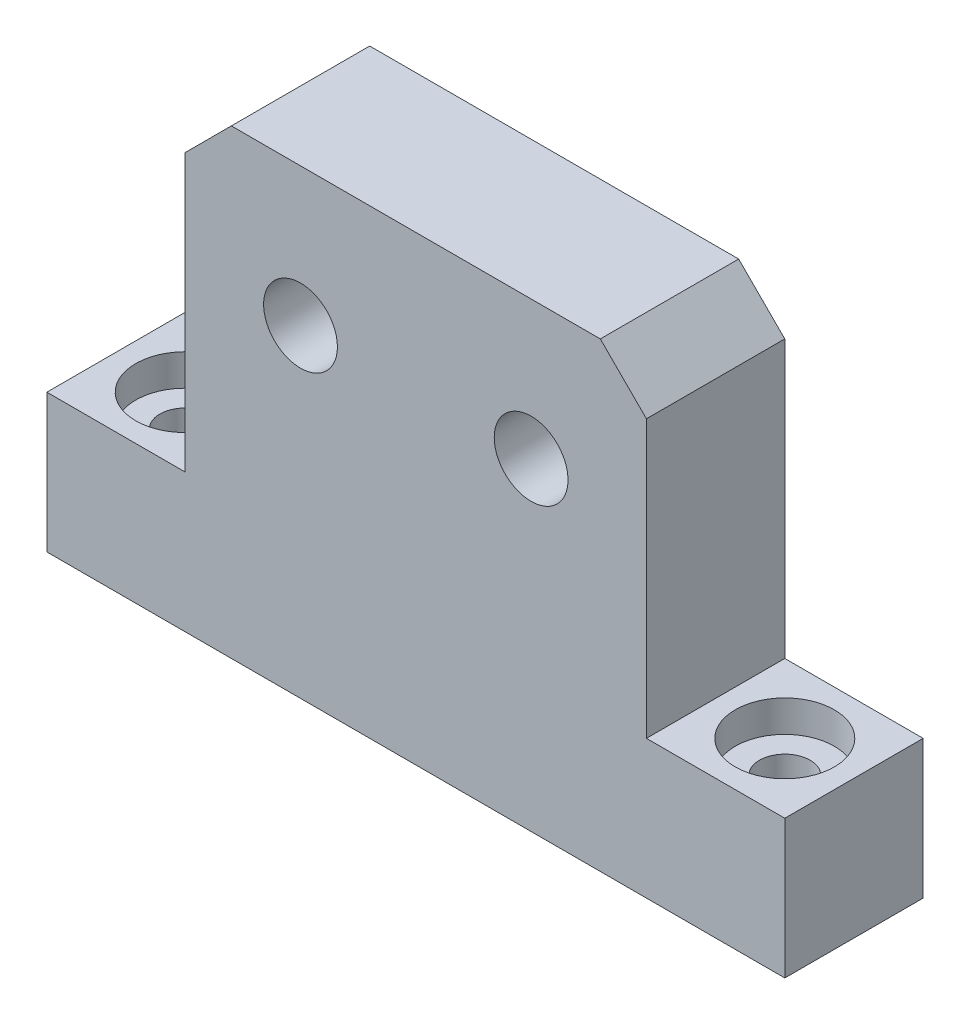
ISO-10303-21;
HEADER;
FILE_DESCRIPTION(('STEP AP214'),'2;1');
FILE_NAME('part.step','',(''),(''),'','','');
FILE_SCHEMA(('AUTOMOTIVE_DESIGN { 1 0 10303 214 1 1 1 1 }'));
ENDSEC;
DATA;
#1=APPLICATION_CONTEXT('core data for automotive mechanical design processes');
#2=APPLICATION_PROTOCOL_DEFINITION('international standard','automotive_design',2000,#1);
#3=PRODUCT_CONTEXT('',#1,'mechanical');
#4=PRODUCT('Part','Part','',(#3));
#5=PRODUCT_RELATED_PRODUCT_CATEGORY('part','',(#4));
#6=PRODUCT_DEFINITION_FORMATION('','',#4);
#7=PRODUCT_DEFINITION_CONTEXT('part definition',#1,'design');
#8=PRODUCT_DEFINITION('design','',#6,#7);
#9=PRODUCT_DEFINITION_SHAPE('','',#8);
#10=(LENGTH_UNIT() NAMED_UNIT(*) SI_UNIT(.MILLI.,.METRE.));
#11=(NAMED_UNIT(*) PLANE_ANGLE_UNIT() SI_UNIT($,.RADIAN.));
#12=(NAMED_UNIT(*) SI_UNIT($,.STERADIAN.) SOLID_ANGLE_UNIT());
#13=UNCERTAINTY_MEASURE_WITH_UNIT(LENGTH_MEASURE(1.E-05),#10,'distance_accuracy_value','');
#14=(GEOMETRIC_REPRESENTATION_CONTEXT(3) GLOBAL_UNCERTAINTY_ASSIGNED_CONTEXT((#13)) GLOBAL_UNIT_ASSIGNED_CONTEXT((#10,
#11,#12)) REPRESENTATION_CONTEXT('',''));
#15=CARTESIAN_POINT('',(0.,0.,0.));
#16=DIRECTION('',(0.,0.,1.));
#17=DIRECTION('',(1.,0.,0.));
#18=AXIS2_PLACEMENT_3D('',#15,#16,#17);
#19=CARTESIAN_POINT('',(0.,0.,30.));
#20=DIRECTION('',(0.,0.,-1.));
#21=DIRECTION('',(-1.,0.,0.));
#22=AXIS2_PLACEMENT_3D('',#19,#20,#21);
#23=PLANE('',#22);
#24=DIRECTION('',(-1.,0.,0.));
#25=VECTOR('',#24,1.);
#26=CARTESIAN_POINT('',(50.,100.,30.));
#27=LINE('',#26,#25);
#28=CARTESIAN_POINT('',(40.,100.,30.));
#29=VERTEX_POINT('',#28);
#30=CARTESIAN_POINT('',(-40.,100.,30.));
#31=VERTEX_POINT('',#30);
#32=EDGE_CURVE('E132',#29,#31,#27,.T.);
#33=ORIENTED_EDGE('',*,*,#32,.T.);
#34=DIRECTION('',(0.707106781186548,0.707106781186548,0.));
#35=VECTOR('',#34,1.);
#36=CARTESIAN_POINT('',(-50.,90.,30.));
#37=LINE('',#36,#35);
#38=CARTESIAN_POINT('',(-50.,90.,30.));
#39=VERTEX_POINT('',#38);
#40=EDGE_CURVE('E51',#31,#39,#37,.F.);
#41=ORIENTED_EDGE('',*,*,#40,.T.);
#42=DIRECTION('',(0.,-1.,0.));
#43=VECTOR('',#42,1.);
#44=CARTESIAN_POINT('',(-50.,30.,30.));
#45=LINE('',#44,#43);
#46=CARTESIAN_POINT('',(-50.,30.,30.));
#47=VERTEX_POINT('',#46);
#48=EDGE_CURVE('E121',#39,#47,#45,.T.);
#49=ORIENTED_EDGE('',*,*,#48,.T.);
#50=DIRECTION('',(-1.,0.,0.));
#51=VECTOR('',#50,1.);
#52=CARTESIAN_POINT('',(-80.,30.,30.));
#53=LINE('',#52,#51);
#54=CARTESIAN_POINT('',(-80.,30.,30.));
#55=VERTEX_POINT('',#54);
#56=EDGE_CURVE('E125',#47,#55,#53,.T.);
#57=ORIENTED_EDGE('',*,*,#56,.T.);
#58=DIRECTION('',(0.,-1.,0.));
#59=VECTOR('',#58,1.);
#60=CARTESIAN_POINT('',(-80.,0.,30.));
#61=LINE('',#60,#59);
#62=CARTESIAN_POINT('',(-80.,0.,30.));
#63=VERTEX_POINT('',#62);
#64=EDGE_CURVE('E149',#55,#63,#61,.T.);
#65=ORIENTED_EDGE('',*,*,#64,.T.);
#66=DIRECTION('',(1.,0.,0.));
#67=VECTOR('',#66,1.);
#68=CARTESIAN_POINT('',(80.,0.,30.));
#69=LINE('',#68,#67);
#70=CARTESIAN_POINT('',(80.,0.,30.));
#71=VERTEX_POINT('',#70);
#72=EDGE_CURVE('E152',#63,#71,#69,.T.);
#73=ORIENTED_EDGE('',*,*,#72,.T.);
#74=DIRECTION('',(0.,1.,0.));
#75=VECTOR('',#74,1.);
#76=CARTESIAN_POINT('',(80.,0.,30.));
#77=LINE('',#76,#75);
#78=CARTESIAN_POINT('',(80.,30.,30.));
#79=VERTEX_POINT('',#78);
#80=EDGE_CURVE('E158',#71,#79,#77,.T.);
#81=ORIENTED_EDGE('',*,*,#80,.T.);
#82=DIRECTION('',(-1.,0.,0.));
#83=VECTOR('',#82,1.);
#84=CARTESIAN_POINT('',(80.,30.,30.));
#85=LINE('',#84,#83);
#86=CARTESIAN_POINT('',(50.,30.,30.));
#87=VERTEX_POINT('',#86);
#88=EDGE_CURVE('E161',#79,#87,#85,.T.);
#89=ORIENTED_EDGE('',*,*,#88,.T.);
#90=DIRECTION('',(0.,1.,0.));
#91=VECTOR('',#90,1.);
#92=CARTESIAN_POINT('',(50.,30.,30.));
#93=LINE('',#92,#91);
#94=CARTESIAN_POINT('',(50.,90.,30.));
#95=VERTEX_POINT('',#94);
#96=EDGE_CURVE('E164',#87,#95,#93,.T.);
#97=ORIENTED_EDGE('',*,*,#96,.T.);
#98=DIRECTION('',(0.707106781186547,-0.707106781186549,0.));
#99=VECTOR('',#98,1.);
#100=CARTESIAN_POINT('',(40.,100.,30.));
#101=LINE('',#100,#99);
#102=EDGE_CURVE('E223',#95,#29,#101,.F.);
#103=ORIENTED_EDGE('',*,*,#102,.T.);
#104=EDGE_LOOP('',(#33,#41,#49,#57,#65,#73,#81,#89,#97,#103));
#105=FACE_BOUND('',#104,.T.);
#106=CARTESIAN_POINT('',(-25.,70.,30.));
#107=DIRECTION('',(0.,0.,1.));
#108=DIRECTION('',(1.,0.,0.));
#109=AXIS2_PLACEMENT_3D('',#106,#107,#108);
#110=CIRCLE('',#109,8.);
#111=CARTESIAN_POINT('',(-17.,70.,30.));
#112=VERTEX_POINT('',#111);
#113=EDGE_CURVE('E171',#112,#112,#110,.T.);
#114=ORIENTED_EDGE('',*,*,#113,.F.);
#115=EDGE_LOOP('',(#114));
#116=FACE_BOUND('',#115,.T.);
#117=CARTESIAN_POINT('',(25.,70.,30.));
#118=DIRECTION('',(0.,0.,1.));
#119=DIRECTION('',(-1.,0.,0.));
#120=AXIS2_PLACEMENT_3D('',#117,#118,#119);
#121=CIRCLE('',#120,8.);
#122=CARTESIAN_POINT('',(17.,70.,30.));
#123=VERTEX_POINT('',#122);
#124=EDGE_CURVE('E477',#123,#123,#121,.T.);
#125=ORIENTED_EDGE('',*,*,#124,.F.);
#126=EDGE_LOOP('',(#125));
#127=FACE_BOUND('',#126,.T.);
#128=ADVANCED_FACE('F41',(#105,#116,#127),#23,.F.);
#129=CARTESIAN_POINT('',(0.,0.,0.));
#130=DIRECTION('',(0.,0.,-1.));
#131=DIRECTION('',(-1.,0.,0.));
#132=AXIS2_PLACEMENT_3D('',#129,#130,#131);
#133=PLANE('',#132);
#134=CARTESIAN_POINT('',(-25.,70.,0.));
#135=DIRECTION('',(0.,0.,1.));
#136=DIRECTION('',(1.,0.,0.));
#137=AXIS2_PLACEMENT_3D('',#134,#135,#136);
#138=CIRCLE('',#137,8.);
#139=CARTESIAN_POINT('',(-17.,70.,0.));
#140=VERTEX_POINT('',#139);
#141=EDGE_CURVE('E481',#140,#140,#138,.T.);
#142=ORIENTED_EDGE('',*,*,#141,.T.);
#143=EDGE_LOOP('',(#142));
#144=FACE_BOUND('',#143,.T.);
#145=DIRECTION('',(0.,-1.,0.));
#146=VECTOR('',#145,1.);
#147=CARTESIAN_POINT('',(-50.,30.,0.));
#148=LINE('',#147,#146);
#149=CARTESIAN_POINT('',(-50.,90.,0.));
#150=VERTEX_POINT('',#149);
#151=CARTESIAN_POINT('',(-50.,30.,0.));
#152=VERTEX_POINT('',#151);
#153=EDGE_CURVE('E138',#150,#152,#148,.T.);
#154=ORIENTED_EDGE('',*,*,#153,.F.);
#155=DIRECTION('',(-0.707106781186548,-0.707106781186548,0.));
#156=VECTOR('',#155,1.);
#157=CARTESIAN_POINT('',(-70.,70.,0.));
#158=LINE('',#157,#156);
#159=CARTESIAN_POINT('',(-40.,100.,0.));
#160=VERTEX_POINT('',#159);
#161=EDGE_CURVE('E214',#150,#160,#158,.F.);
#162=ORIENTED_EDGE('',*,*,#161,.T.);
#163=DIRECTION('',(-1.,0.,0.));
#164=VECTOR('',#163,1.);
#165=CARTESIAN_POINT('',(-50.,100.,0.));
#166=LINE('',#165,#164);
#167=CARTESIAN_POINT('',(40.,100.,0.));
#168=VERTEX_POINT('',#167);
#169=EDGE_CURVE('E168',#168,#160,#166,.T.);
#170=ORIENTED_EDGE('',*,*,#169,.F.);
#171=DIRECTION('',(-0.707106781186547,0.707106781186549,0.));
#172=VECTOR('',#171,1.);
#173=CARTESIAN_POINT('',(70.,69.9999999999998,0.));
#174=LINE('',#173,#172);
#175=CARTESIAN_POINT('',(50.,90.,0.));
#176=VERTEX_POINT('',#175);
#177=EDGE_CURVE('E211',#168,#176,#174,.F.);
#178=ORIENTED_EDGE('',*,*,#177,.T.);
#179=DIRECTION('',(0.,1.,0.));
#180=VECTOR('',#179,1.);
#181=CARTESIAN_POINT('',(50.,30.,0.));
#182=LINE('',#181,#180);
#183=CARTESIAN_POINT('',(50.,30.,0.));
#184=VERTEX_POINT('',#183);
#185=EDGE_CURVE('E189',#184,#176,#182,.T.);
#186=ORIENTED_EDGE('',*,*,#185,.F.);
#187=DIRECTION('',(-1.,0.,0.));
#188=VECTOR('',#187,1.);
#189=CARTESIAN_POINT('',(80.,30.,0.));
#190=LINE('',#189,#188);
#191=CARTESIAN_POINT('',(80.,30.,0.));
#192=VERTEX_POINT('',#191);
#193=EDGE_CURVE('E186',#192,#184,#190,.T.);
#194=ORIENTED_EDGE('',*,*,#193,.F.);
#195=DIRECTION('',(0.,1.,0.));
#196=VECTOR('',#195,1.);
#197=CARTESIAN_POINT('',(80.,0.,0.));
#198=LINE('',#197,#196);
#199=CARTESIAN_POINT('',(80.,0.,0.));
#200=VERTEX_POINT('',#199);
#201=EDGE_CURVE('E183',#200,#192,#198,.T.);
#202=ORIENTED_EDGE('',*,*,#201,.F.);
#203=DIRECTION('',(1.,0.,0.));
#204=VECTOR('',#203,1.);
#205=CARTESIAN_POINT('',(80.,0.,0.));
#206=LINE('',#205,#204);
#207=CARTESIAN_POINT('',(-80.,0.,0.));
#208=VERTEX_POINT('',#207);
#209=EDGE_CURVE('E180',#208,#200,#206,.T.);
#210=ORIENTED_EDGE('',*,*,#209,.F.);
#211=DIRECTION('',(0.,-1.,0.));
#212=VECTOR('',#211,1.);
#213=CARTESIAN_POINT('',(-80.,0.,0.));
#214=LINE('',#213,#212);
#215=CARTESIAN_POINT('',(-80.,30.,0.));
#216=VERTEX_POINT('',#215);
#217=EDGE_CURVE('E177',#216,#208,#214,.T.);
#218=ORIENTED_EDGE('',*,*,#217,.F.);
#219=DIRECTION('',(-1.,0.,0.));
#220=VECTOR('',#219,1.);
#221=CARTESIAN_POINT('',(-80.,30.,0.));
#222=LINE('',#221,#220);
#223=EDGE_CURVE('E174',#152,#216,#222,.T.);
#224=ORIENTED_EDGE('',*,*,#223,.F.);
#225=EDGE_LOOP('',(#154,#162,#170,#178,#186,#194,#202,#210,#218,#224));
#226=FACE_BOUND('',#225,.T.);
#227=CARTESIAN_POINT('',(25.,70.,0.));
#228=DIRECTION('',(0.,0.,1.));
#229=DIRECTION('',(-1.,0.,0.));
#230=AXIS2_PLACEMENT_3D('',#227,#228,#229);
#231=CIRCLE('',#230,8.);
#232=CARTESIAN_POINT('',(17.,70.,0.));
#233=VERTEX_POINT('',#232);
#234=EDGE_CURVE('E476',#233,#233,#231,.T.);
#235=ORIENTED_EDGE('',*,*,#234,.T.);
#236=EDGE_LOOP('',(#235));
#237=FACE_BOUND('',#236,.T.);
#238=ADVANCED_FACE('F234',(#144,#226,#237),#133,.T.);
#239=CARTESIAN_POINT('',(-50.,100.,30.));
#240=DIRECTION('',(0.,-1.,0.));
#241=DIRECTION('',(1.,0.,0.));
#242=AXIS2_PLACEMENT_3D('',#239,#240,#241);
#243=PLANE('',#242);
#244=ORIENTED_EDGE('',*,*,#169,.T.);
#245=DIRECTION('',(0.,0.,1.));
#246=VECTOR('',#245,1.);
#247=CARTESIAN_POINT('',(-40.,100.,30.));
#248=LINE('',#247,#246);
#249=EDGE_CURVE('E64',#160,#31,#248,.T.);
#250=ORIENTED_EDGE('',*,*,#249,.T.);
#251=ORIENTED_EDGE('',*,*,#32,.F.);
#252=DIRECTION('',(0.,0.,-1.));
#253=VECTOR('',#252,1.);
#254=CARTESIAN_POINT('',(40.,100.,30.));
#255=LINE('',#254,#253);
#256=EDGE_CURVE('E217',#29,#168,#255,.T.);
#257=ORIENTED_EDGE('',*,*,#256,.T.);
#258=EDGE_LOOP('',(#244,#250,#251,#257));
#259=FACE_BOUND('',#258,.T.);
#260=ADVANCED_FACE('F229',(#259),#243,.F.);
#261=CARTESIAN_POINT('',(-50.,30.,30.));
#262=DIRECTION('',(1.,0.,0.));
#263=DIRECTION('',(0.,0.,-1.));
#264=AXIS2_PLACEMENT_3D('',#261,#262,#263);
#265=PLANE('',#264);
#266=ORIENTED_EDGE('',*,*,#48,.F.);
#267=DIRECTION('',(0.,0.,-1.));
#268=VECTOR('',#267,1.);
#269=CARTESIAN_POINT('',(-50.,90.,30.));
#270=LINE('',#269,#268);
#271=EDGE_CURVE('E142',#39,#150,#270,.T.);
#272=ORIENTED_EDGE('',*,*,#271,.T.);
#273=ORIENTED_EDGE('',*,*,#153,.T.);
#274=DIRECTION('',(0.,0.,-1.));
#275=VECTOR('',#274,1.);
#276=CARTESIAN_POINT('',(-50.,30.,30.));
#277=LINE('',#276,#275);
#278=EDGE_CURVE('E135',#47,#152,#277,.T.);
#279=ORIENTED_EDGE('',*,*,#278,.F.);
#280=EDGE_LOOP('',(#266,#272,#273,#279));
#281=FACE_BOUND('',#280,.T.);
#282=ADVANCED_FACE('F136',(#281),#265,.F.);
#283=CARTESIAN_POINT('',(-80.,30.,30.));
#284=DIRECTION('',(0.,-1.,0.));
#285=DIRECTION('',(0.,0.,-1.));
#286=AXIS2_PLACEMENT_3D('',#283,#284,#285);
#287=PLANE('',#286);
#288=CARTESIAN_POINT('',(-65.,30.,15.));
#289=DIRECTION('',(0.,1.,0.));
#290=DIRECTION('',(0.,0.,1.));
#291=AXIS2_PLACEMENT_3D('',#288,#289,#290);
#292=CIRCLE('',#291,10.74);
#293=CARTESIAN_POINT('',(-65.,30.,25.74));
#294=VERTEX_POINT('',#293);
#295=EDGE_CURVE('E446',#294,#294,#292,.T.);
#296=ORIENTED_EDGE('',*,*,#295,.F.);
#297=EDGE_LOOP('',(#296));
#298=FACE_BOUND('',#297,.T.);
#299=ORIENTED_EDGE('',*,*,#223,.T.);
#300=DIRECTION('',(0.,0.,-1.));
#301=VECTOR('',#300,1.);
#302=CARTESIAN_POINT('',(-80.,30.,30.));
#303=LINE('',#302,#301);
#304=EDGE_CURVE('E143',#55,#216,#303,.T.);
#305=ORIENTED_EDGE('',*,*,#304,.F.);
#306=ORIENTED_EDGE('',*,*,#56,.F.);
#307=ORIENTED_EDGE('',*,*,#278,.T.);
#308=EDGE_LOOP('',(#299,#305,#306,#307));
#309=FACE_BOUND('',#308,.T.);
#310=ADVANCED_FACE('F145',(#298,#309),#287,.F.);
#311=CARTESIAN_POINT('',(-80.,0.,30.));
#312=DIRECTION('',(1.,0.,0.));
#313=DIRECTION('',(0.,0.,-1.));
#314=AXIS2_PLACEMENT_3D('',#311,#312,#313);
#315=PLANE('',#314);
#316=ORIENTED_EDGE('',*,*,#217,.T.);
#317=DIRECTION('',(0.,0.,-1.));
#318=VECTOR('',#317,1.);
#319=CARTESIAN_POINT('',(-80.,0.,30.));
#320=LINE('',#319,#318);
#321=EDGE_CURVE('E203',#63,#208,#320,.T.);
#322=ORIENTED_EDGE('',*,*,#321,.F.);
#323=ORIENTED_EDGE('',*,*,#64,.F.);
#324=ORIENTED_EDGE('',*,*,#304,.T.);
#325=EDGE_LOOP('',(#316,#322,#323,#324));
#326=FACE_BOUND('',#325,.T.);
#327=ADVANCED_FACE('F255',(#326),#315,.F.);
#328=CARTESIAN_POINT('',(80.,0.,30.));
#329=DIRECTION('',(0.,1.,0.));
#330=DIRECTION('',(0.,0.,1.));
#331=AXIS2_PLACEMENT_3D('',#328,#329,#330);
#332=PLANE('',#331);
#333=CARTESIAN_POINT('',(-65.,0.,15.));
#334=DIRECTION('',(0.,1.,0.));
#335=DIRECTION('',(0.,0.,1.));
#336=AXIS2_PLACEMENT_3D('',#333,#334,#335);
#337=CIRCLE('',#336,5.49999999999999);
#338=CARTESIAN_POINT('',(-65.,0.,20.5));
#339=VERTEX_POINT('',#338);
#340=EDGE_CURVE('E456',#339,#339,#337,.T.);
#341=ORIENTED_EDGE('',*,*,#340,.T.);
#342=EDGE_LOOP('',(#341));
#343=FACE_BOUND('',#342,.T.);
#344=CARTESIAN_POINT('',(65.,0.,15.));
#345=DIRECTION('',(0.,1.,0.));
#346=DIRECTION('',(0.,0.,1.));
#347=AXIS2_PLACEMENT_3D('',#344,#345,#346);
#348=CIRCLE('',#347,5.49999999999999);
#349=CARTESIAN_POINT('',(65.,0.,20.5));
#350=VERTEX_POINT('',#349);
#351=EDGE_CURVE('E472',#350,#350,#348,.T.);
#352=ORIENTED_EDGE('',*,*,#351,.T.);
#353=EDGE_LOOP('',(#352));
#354=FACE_BOUND('',#353,.T.);
#355=ORIENTED_EDGE('',*,*,#209,.T.);
#356=DIRECTION('',(0.,0.,-1.));
#357=VECTOR('',#356,1.);
#358=CARTESIAN_POINT('',(80.,0.,30.));
#359=LINE('',#358,#357);
#360=EDGE_CURVE('E199',#71,#200,#359,.T.);
#361=ORIENTED_EDGE('',*,*,#360,.F.);
#362=ORIENTED_EDGE('',*,*,#72,.F.);
#363=ORIENTED_EDGE('',*,*,#321,.T.);
#364=EDGE_LOOP('',(#355,#361,#362,#363));
#365=FACE_BOUND('',#364,.T.);
#366=ADVANCED_FACE('F252',(#343,#354,#365),#332,.F.);
#367=CARTESIAN_POINT('',(80.,0.,30.));
#368=DIRECTION('',(-1.,0.,0.));
#369=DIRECTION('',(0.,0.,1.));
#370=AXIS2_PLACEMENT_3D('',#367,#368,#369);
#371=PLANE('',#370);
#372=ORIENTED_EDGE('',*,*,#201,.T.);
#373=DIRECTION('',(0.,0.,-1.));
#374=VECTOR('',#373,1.);
#375=CARTESIAN_POINT('',(80.,30.,30.));
#376=LINE('',#375,#374);
#377=EDGE_CURVE('E195',#79,#192,#376,.T.);
#378=ORIENTED_EDGE('',*,*,#377,.F.);
#379=ORIENTED_EDGE('',*,*,#80,.F.);
#380=ORIENTED_EDGE('',*,*,#360,.T.);
#381=EDGE_LOOP('',(#372,#378,#379,#380));
#382=FACE_BOUND('',#381,.T.);
#383=ADVANCED_FACE('F247',(#382),#371,.F.);
#384=CARTESIAN_POINT('',(80.,30.,30.));
#385=DIRECTION('',(0.,-1.,0.));
#386=DIRECTION('',(0.,0.,-1.));
#387=AXIS2_PLACEMENT_3D('',#384,#385,#386);
#388=PLANE('',#387);
#389=CARTESIAN_POINT('',(65.,30.,15.));
#390=DIRECTION('',(0.,1.,0.));
#391=DIRECTION('',(0.,0.,1.));
#392=AXIS2_PLACEMENT_3D('',#389,#390,#391);
#393=CIRCLE('',#392,10.74);
#394=CARTESIAN_POINT('',(65.,30.,25.74));
#395=VERTEX_POINT('',#394);
#396=EDGE_CURVE('E460',#395,#395,#393,.T.);
#397=ORIENTED_EDGE('',*,*,#396,.F.);
#398=EDGE_LOOP('',(#397));
#399=FACE_BOUND('',#398,.T.);
#400=ORIENTED_EDGE('',*,*,#193,.T.);
#401=DIRECTION('',(0.,0.,-1.));
#402=VECTOR('',#401,1.);
#403=CARTESIAN_POINT('',(50.,30.,30.));
#404=LINE('',#403,#402);
#405=EDGE_CURVE('E167',#87,#184,#404,.T.);
#406=ORIENTED_EDGE('',*,*,#405,.F.);
#407=ORIENTED_EDGE('',*,*,#88,.F.);
#408=ORIENTED_EDGE('',*,*,#377,.T.);
#409=EDGE_LOOP('',(#400,#406,#407,#408));
#410=FACE_BOUND('',#409,.T.);
#411=ADVANCED_FACE('F241',(#399,#410),#388,.F.);
#412=CARTESIAN_POINT('',(50.,30.,30.));
#413=DIRECTION('',(-1.,0.,0.));
#414=DIRECTION('',(0.,0.,1.));
#415=AXIS2_PLACEMENT_3D('',#412,#413,#414);
#416=PLANE('',#415);
#417=ORIENTED_EDGE('',*,*,#185,.T.);
#418=DIRECTION('',(0.,0.,1.));
#419=VECTOR('',#418,1.);
#420=CARTESIAN_POINT('',(50.,90.,30.));
#421=LINE('',#420,#419);
#422=EDGE_CURVE('E11',#176,#95,#421,.T.);
#423=ORIENTED_EDGE('',*,*,#422,.T.);
#424=ORIENTED_EDGE('',*,*,#96,.F.);
#425=ORIENTED_EDGE('',*,*,#405,.T.);
#426=EDGE_LOOP('',(#417,#423,#424,#425));
#427=FACE_BOUND('',#426,.T.);
#428=ADVANCED_FACE('F237',(#427),#416,.F.);
#429=CARTESIAN_POINT('',(-25.,70.,30.));
#430=DIRECTION('',(0.,0.,-1.));
#431=DIRECTION('',(-1.,0.,0.));
#432=AXIS2_PLACEMENT_3D('',#429,#430,#431);
#433=CYLINDRICAL_SURFACE('',#432,8.);
#434=ORIENTED_EDGE('',*,*,#113,.T.);
#435=EDGE_LOOP('',(#434));
#436=FACE_BOUND('',#435,.T.);
#437=ORIENTED_EDGE('',*,*,#141,.F.);
#438=EDGE_LOOP('',(#437));
#439=FACE_BOUND('',#438,.T.);
#440=ADVANCED_FACE('F265',(#436,#439),#433,.F.);
#441=CARTESIAN_POINT('',(25.,70.,30.));
#442=DIRECTION('',(0.,0.,-1.));
#443=DIRECTION('',(-1.,0.,0.));
#444=AXIS2_PLACEMENT_3D('',#441,#442,#443);
#445=CYLINDRICAL_SURFACE('',#444,8.);
#446=ORIENTED_EDGE('',*,*,#124,.T.);
#447=EDGE_LOOP('',(#446));
#448=FACE_BOUND('',#447,.T.);
#449=ORIENTED_EDGE('',*,*,#234,.F.);
#450=EDGE_LOOP('',(#449));
#451=FACE_BOUND('',#450,.T.);
#452=ADVANCED_FACE('F259',(#448,#451),#445,.F.);
#453=CARTESIAN_POINT('',(-50.,90.,30.));
#454=DIRECTION('',(0.707106781186547,-0.707106781186547,0.));
#455=DIRECTION('',(0.,0.,-1.));
#456=AXIS2_PLACEMENT_3D('',#453,#454,#455);
#457=PLANE('',#456);
#458=ORIENTED_EDGE('',*,*,#40,.F.);
#459=ORIENTED_EDGE('',*,*,#249,.F.);
#460=ORIENTED_EDGE('',*,*,#161,.F.);
#461=ORIENTED_EDGE('',*,*,#271,.F.);
#462=EDGE_LOOP('',(#458,#459,#460,#461));
#463=FACE_BOUND('',#462,.T.);
#464=ADVANCED_FACE('F257',(#463),#457,.F.);
#465=CARTESIAN_POINT('',(40.,100.,30.));
#466=DIRECTION('',(-0.707106781186548,-0.707106781186546,0.));
#467=DIRECTION('',(0.,0.,-1.));
#468=AXIS2_PLACEMENT_3D('',#465,#466,#467);
#469=PLANE('',#468);
#470=ORIENTED_EDGE('',*,*,#102,.F.);
#471=ORIENTED_EDGE('',*,*,#422,.F.);
#472=ORIENTED_EDGE('',*,*,#177,.F.);
#473=ORIENTED_EDGE('',*,*,#256,.F.);
#474=EDGE_LOOP('',(#470,#471,#472,#473));
#475=FACE_BOUND('',#474,.T.);
#476=ADVANCED_FACE('F44',(#475),#469,.F.);
#477=CARTESIAN_POINT('',(65.,30.,15.));
#478=DIRECTION('',(0.,1.,0.));
#479=DIRECTION('',(0.,0.,1.));
#480=AXIS2_PLACEMENT_3D('',#477,#478,#479);
#481=CYLINDRICAL_SURFACE('',#480,5.5);
#482=ORIENTED_EDGE('',*,*,#351,.F.);
#483=EDGE_LOOP('',(#482));
#484=FACE_BOUND('',#483,.T.);
#485=CARTESIAN_POINT('',(65.,23.15,15.));
#486=DIRECTION('',(0.,1.,0.));
#487=DIRECTION('',(0.,0.,1.));
#488=AXIS2_PLACEMENT_3D('',#485,#486,#487);
#489=CIRCLE('',#488,5.50000000000001);
#490=CARTESIAN_POINT('',(65.,23.15,20.5));
#491=VERTEX_POINT('',#490);
#492=EDGE_CURVE('E468',#491,#491,#489,.T.);
#493=ORIENTED_EDGE('',*,*,#492,.T.);
#494=EDGE_LOOP('',(#493));
#495=FACE_BOUND('',#494,.T.);
#496=ADVANCED_FACE('F264',(#484,#495),#481,.F.);
#497=CARTESIAN_POINT('',(70.5,23.15,15.));
#498=DIRECTION('',(0.,-1.,0.));
#499=DIRECTION('',(0.,0.,-1.));
#500=AXIS2_PLACEMENT_3D('',#497,#498,#499);
#501=PLANE('',#500);
#502=ORIENTED_EDGE('',*,*,#492,.F.);
#503=EDGE_LOOP('',(#502));
#504=FACE_BOUND('',#503,.T.);
#505=CARTESIAN_POINT('',(65.,23.15,15.));
#506=DIRECTION('',(0.,1.,0.));
#507=DIRECTION('',(0.,0.,1.));
#508=AXIS2_PLACEMENT_3D('',#505,#506,#507);
#509=CIRCLE('',#508,10.74);
#510=CARTESIAN_POINT('',(65.,23.15,25.74));
#511=VERTEX_POINT('',#510);
#512=EDGE_CURVE('E464',#511,#511,#509,.T.);
#513=ORIENTED_EDGE('',*,*,#512,.T.);
#514=EDGE_LOOP('',(#513));
#515=FACE_BOUND('',#514,.T.);
#516=ADVANCED_FACE('F386',(#504,#515),#501,.F.);
#517=CARTESIAN_POINT('',(65.,30.,15.));
#518=DIRECTION('',(0.,1.,0.));
#519=DIRECTION('',(0.,0.,1.));
#520=AXIS2_PLACEMENT_3D('',#517,#518,#519);
#521=CYLINDRICAL_SURFACE('',#520,10.74);
#522=ORIENTED_EDGE('',*,*,#512,.F.);
#523=EDGE_LOOP('',(#522));
#524=FACE_BOUND('',#523,.T.);
#525=ORIENTED_EDGE('',*,*,#396,.T.);
#526=EDGE_LOOP('',(#525));
#527=FACE_BOUND('',#526,.T.);
#528=ADVANCED_FACE('F395',(#524,#527),#521,.F.);
#529=CARTESIAN_POINT('',(-65.,30.,15.));
#530=DIRECTION('',(0.,1.,0.));
#531=DIRECTION('',(0.,0.,1.));
#532=AXIS2_PLACEMENT_3D('',#529,#530,#531);
#533=CYLINDRICAL_SURFACE('',#532,5.5);
#534=ORIENTED_EDGE('',*,*,#340,.F.);
#535=EDGE_LOOP('',(#534));
#536=FACE_BOUND('',#535,.T.);
#537=CARTESIAN_POINT('',(-65.,23.15,15.));
#538=DIRECTION('',(0.,1.,0.));
#539=DIRECTION('',(0.,0.,1.));
#540=AXIS2_PLACEMENT_3D('',#537,#538,#539);
#541=CIRCLE('',#540,5.50000000000001);
#542=CARTESIAN_POINT('',(-65.,23.15,20.5));
#543=VERTEX_POINT('',#542);
#544=EDGE_CURVE('E450',#543,#543,#541,.T.);
#545=ORIENTED_EDGE('',*,*,#544,.T.);
#546=EDGE_LOOP('',(#545));
#547=FACE_BOUND('',#546,.T.);
#548=ADVANCED_FACE('F404',(#536,#547),#533,.F.);
#549=CARTESIAN_POINT('',(-59.5,23.15,15.));
#550=DIRECTION('',(0.,-1.,0.));
#551=DIRECTION('',(0.,0.,-1.));
#552=AXIS2_PLACEMENT_3D('',#549,#550,#551);
#553=PLANE('',#552);
#554=ORIENTED_EDGE('',*,*,#544,.F.);
#555=EDGE_LOOP('',(#554));
#556=FACE_BOUND('',#555,.T.);
#557=CARTESIAN_POINT('',(-65.,23.15,15.));
#558=DIRECTION('',(0.,1.,0.));
#559=DIRECTION('',(0.,0.,1.));
#560=AXIS2_PLACEMENT_3D('',#557,#558,#559);
#561=CIRCLE('',#560,10.74);
#562=CARTESIAN_POINT('',(-65.,23.15,25.74));
#563=VERTEX_POINT('',#562);
#564=EDGE_CURVE('E443',#563,#563,#561,.T.);
#565=ORIENTED_EDGE('',*,*,#564,.T.);
#566=EDGE_LOOP('',(#565));
#567=FACE_BOUND('',#566,.T.);
#568=ADVANCED_FACE('F413',(#556,#567),#553,.F.);
#569=CARTESIAN_POINT('',(-65.,30.,15.));
#570=DIRECTION('',(0.,1.,0.));
#571=DIRECTION('',(0.,0.,1.));
#572=AXIS2_PLACEMENT_3D('',#569,#570,#571);
#573=CYLINDRICAL_SURFACE('',#572,10.74);
#574=ORIENTED_EDGE('',*,*,#564,.F.);
#575=EDGE_LOOP('',(#574));
#576=FACE_BOUND('',#575,.T.);
#577=ORIENTED_EDGE('',*,*,#295,.T.);
#578=EDGE_LOOP('',(#577));
#579=FACE_BOUND('',#578,.T.);
#580=ADVANCED_FACE('F422',(#576,#579),#573,.F.);
#581=CLOSED_SHELL('',(#128,#238,#260,#282,#310,#327,#366,#383,#411,#428,#440,#452,#464,#476,
#496,#516,#528,#548,#568,#580));
#582=MANIFOLD_SOLID_BREP('B2',#581);
#583=ADVANCED_BREP_SHAPE_REPRESENTATION('',(#18,#582),#14);
#584=SHAPE_DEFINITION_REPRESENTATION(#9,#583);
ENDSEC;
END-ISO-10303-21;
